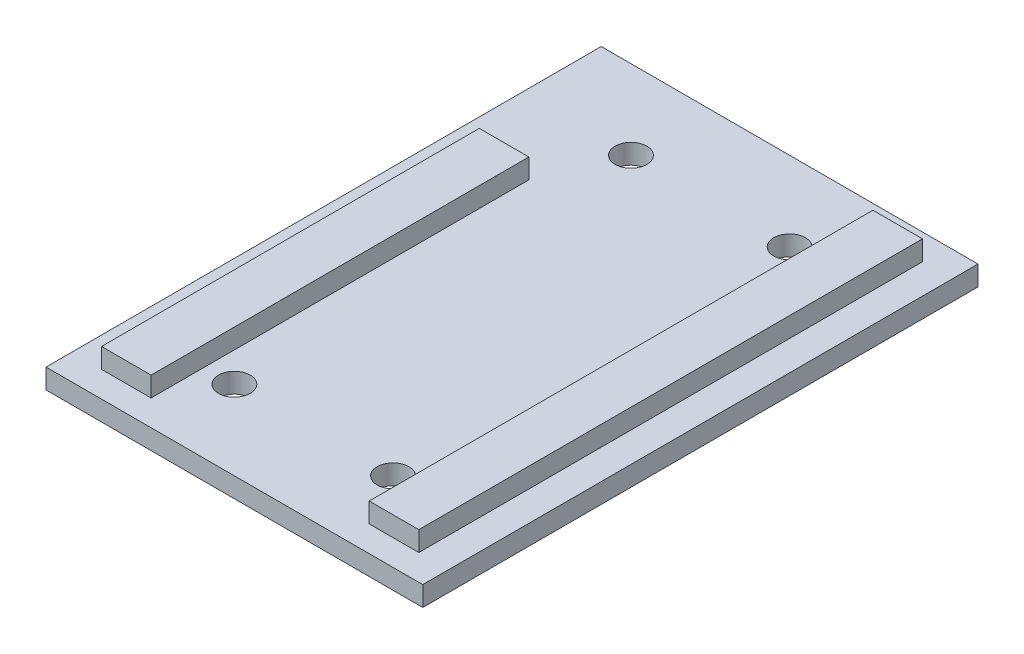
ISO-10303-21;
HEADER;
FILE_DESCRIPTION(('STEP AP214'),'2;1');
FILE_NAME('part.step','',(''),(''),'','','');
FILE_SCHEMA(('AUTOMOTIVE_DESIGN { 1 0 10303 214 1 1 1 1 }'));
ENDSEC;
DATA;
#1=APPLICATION_CONTEXT('core data for automotive mechanical design processes');
#2=APPLICATION_PROTOCOL_DEFINITION('international standard','automotive_design',2000,#1);
#3=PRODUCT_CONTEXT('',#1,'mechanical');
#4=PRODUCT('Part','Part','',(#3));
#5=PRODUCT_RELATED_PRODUCT_CATEGORY('part','',(#4));
#6=PRODUCT_DEFINITION_FORMATION('','',#4);
#7=PRODUCT_DEFINITION_CONTEXT('part definition',#1,'design');
#8=PRODUCT_DEFINITION('design','',#6,#7);
#9=PRODUCT_DEFINITION_SHAPE('','',#8);
#10=(LENGTH_UNIT() NAMED_UNIT(*) SI_UNIT(.MILLI.,.METRE.));
#11=(NAMED_UNIT(*) PLANE_ANGLE_UNIT() SI_UNIT($,.RADIAN.));
#12=(NAMED_UNIT(*) SI_UNIT($,.STERADIAN.) SOLID_ANGLE_UNIT());
#13=UNCERTAINTY_MEASURE_WITH_UNIT(LENGTH_MEASURE(1.E-05),#10,'distance_accuracy_value','');
#14=(GEOMETRIC_REPRESENTATION_CONTEXT(3) GLOBAL_UNCERTAINTY_ASSIGNED_CONTEXT((#13)) GLOBAL_UNIT_ASSIGNED_CONTEXT((#10,
#11,#12)) REPRESENTATION_CONTEXT('',''));
#15=CARTESIAN_POINT('',(0.,0.,0.));
#16=DIRECTION('',(0.,0.,1.));
#17=DIRECTION('',(1.,0.,0.));
#18=AXIS2_PLACEMENT_3D('',#15,#16,#17);
#19=CARTESIAN_POINT('',(0.,2.,0.));
#20=DIRECTION('',(0.,1.,0.));
#21=DIRECTION('',(0.,0.,1.));
#22=AXIS2_PLACEMENT_3D('',#19,#20,#21);
#23=PLANE('',#22);
#24=CARTESIAN_POINT('',(-8.,2.,20.));
#25=DIRECTION('',(0.,1.,0.));
#26=DIRECTION('',(0.,0.,1.));
#27=AXIS2_PLACEMENT_3D('',#24,#25,#26);
#28=CIRCLE('',#27,1.6);
#29=CARTESIAN_POINT('',(-8.,2.,21.6));
#30=VERTEX_POINT('',#29);
#31=EDGE_CURVE('E467',#30,#30,#28,.T.);
#32=ORIENTED_EDGE('',*,*,#31,.F.);
#33=EDGE_LOOP('',(#32));
#34=FACE_BOUND('',#33,.T.);
#35=CARTESIAN_POINT('',(8.,2.,20.));
#36=DIRECTION('',(0.,1.,0.));
#37=DIRECTION('',(0.,0.,1.));
#38=AXIS2_PLACEMENT_3D('',#35,#36,#37);
#39=CIRCLE('',#38,1.6);
#40=CARTESIAN_POINT('',(8.,2.,21.6));
#41=VERTEX_POINT('',#40);
#42=EDGE_CURVE('E471',#41,#41,#39,.T.);
#43=ORIENTED_EDGE('',*,*,#42,.F.);
#44=EDGE_LOOP('',(#43));
#45=FACE_BOUND('',#44,.T.);
#46=CARTESIAN_POINT('',(-8.,2.,-20.));
#47=DIRECTION('',(0.,1.,0.));
#48=DIRECTION('',(0.,0.,1.));
#49=AXIS2_PLACEMENT_3D('',#46,#47,#48);
#50=CIRCLE('',#49,1.6);
#51=CARTESIAN_POINT('',(-8.,2.,-18.4));
#52=VERTEX_POINT('',#51);
#53=EDGE_CURVE('E481',#52,#52,#50,.T.);
#54=ORIENTED_EDGE('',*,*,#53,.F.);
#55=EDGE_LOOP('',(#54));
#56=FACE_BOUND('',#55,.T.);
#57=CARTESIAN_POINT('',(8.,2.,-20.));
#58=DIRECTION('',(0.,1.,0.));
#59=DIRECTION('',(0.,0.,1.));
#60=AXIS2_PLACEMENT_3D('',#57,#58,#59);
#61=CIRCLE('',#60,1.6);
#62=CARTESIAN_POINT('',(8.,2.,-18.4));
#63=VERTEX_POINT('',#62);
#64=EDGE_CURVE('E489',#63,#63,#61,.T.);
#65=ORIENTED_EDGE('',*,*,#64,.F.);
#66=EDGE_LOOP('',(#65));
#67=FACE_BOUND('',#66,.T.);
#68=DIRECTION('',(0.,0.,-1.));
#69=VECTOR('',#68,1.);
#70=CARTESIAN_POINT('',(19.,2.,-28.));
#71=LINE('',#70,#69);
#72=CARTESIAN_POINT('',(19.,2.,28.));
#73=VERTEX_POINT('',#72);
#74=CARTESIAN_POINT('',(19.,2.,-28.));
#75=VERTEX_POINT('',#74);
#76=EDGE_CURVE('E205',#73,#75,#71,.T.);
#77=ORIENTED_EDGE('',*,*,#76,.T.);
#78=DIRECTION('',(-1.,0.,0.));
#79=VECTOR('',#78,1.);
#80=CARTESIAN_POINT('',(-19.,2.,-28.));
#81=LINE('',#80,#79);
#82=CARTESIAN_POINT('',(-19.,2.,-28.));
#83=VERTEX_POINT('',#82);
#84=EDGE_CURVE('E209',#75,#83,#81,.T.);
#85=ORIENTED_EDGE('',*,*,#84,.T.);
#86=DIRECTION('',(0.,0.,1.));
#87=VECTOR('',#86,1.);
#88=CARTESIAN_POINT('',(-19.,2.,-28.));
#89=LINE('',#88,#87);
#90=CARTESIAN_POINT('',(-19.,2.,28.));
#91=VERTEX_POINT('',#90);
#92=EDGE_CURVE('E213',#83,#91,#89,.T.);
#93=ORIENTED_EDGE('',*,*,#92,.T.);
#94=DIRECTION('',(1.,0.,0.));
#95=VECTOR('',#94,1.);
#96=CARTESIAN_POINT('',(-19.,2.,28.));
#97=LINE('',#96,#95);
#98=EDGE_CURVE('E216',#91,#73,#97,.T.);
#99=ORIENTED_EDGE('',*,*,#98,.T.);
#100=EDGE_LOOP('',(#77,#85,#93,#99));
#101=FACE_BOUND('',#100,.T.);
#102=DIRECTION('',(1.,0.,0.));
#103=VECTOR('',#102,1.);
#104=CARTESIAN_POINT('',(-16.,2.,25.4));
#105=LINE('',#104,#103);
#106=CARTESIAN_POINT('',(-16.,2.,25.4));
#107=VERTEX_POINT('',#106);
#108=CARTESIAN_POINT('',(-11.,2.,25.4));
#109=VERTEX_POINT('',#108);
#110=EDGE_CURVE('E165',#107,#109,#105,.T.);
#111=ORIENTED_EDGE('',*,*,#110,.F.);
#112=DIRECTION('',(0.,0.,1.));
#113=VECTOR('',#112,1.);
#114=CARTESIAN_POINT('',(-16.,2.,-12.7));
#115=LINE('',#114,#113);
#116=CARTESIAN_POINT('',(-16.,2.,-12.7));
#117=VERTEX_POINT('',#116);
#118=EDGE_CURVE('E160',#117,#107,#115,.T.);
#119=ORIENTED_EDGE('',*,*,#118,.F.);
#120=DIRECTION('',(-1.,0.,0.));
#121=VECTOR('',#120,1.);
#122=CARTESIAN_POINT('',(-16.,2.,-12.7));
#123=LINE('',#122,#121);
#124=CARTESIAN_POINT('',(-11.,2.,-12.7));
#125=VERTEX_POINT('',#124);
#126=EDGE_CURVE('E175',#125,#117,#123,.T.);
#127=ORIENTED_EDGE('',*,*,#126,.F.);
#128=DIRECTION('',(0.,0.,-1.));
#129=VECTOR('',#128,1.);
#130=CARTESIAN_POINT('',(-11.,2.,-12.7));
#131=LINE('',#130,#129);
#132=EDGE_CURVE('E187',#109,#125,#131,.T.);
#133=ORIENTED_EDGE('',*,*,#132,.F.);
#134=EDGE_LOOP('',(#111,#119,#127,#133));
#135=FACE_BOUND('',#134,.T.);
#136=DIRECTION('',(-1.,0.,0.));
#137=VECTOR('',#136,1.);
#138=CARTESIAN_POINT('',(16.,2.,-25.4));
#139=LINE('',#138,#137);
#140=CARTESIAN_POINT('',(16.,2.,-25.4));
#141=VERTEX_POINT('',#140);
#142=CARTESIAN_POINT('',(11.,2.,-25.4));
#143=VERTEX_POINT('',#142);
#144=EDGE_CURVE('E504',#141,#143,#139,.T.);
#145=ORIENTED_EDGE('',*,*,#144,.F.);
#146=DIRECTION('',(0.,0.,-1.));
#147=VECTOR('',#146,1.);
#148=CARTESIAN_POINT('',(16.,2.,25.4));
#149=LINE('',#148,#147);
#150=CARTESIAN_POINT('',(16.,2.,25.4));
#151=VERTEX_POINT('',#150);
#152=EDGE_CURVE('E157',#151,#141,#149,.T.);
#153=ORIENTED_EDGE('',*,*,#152,.F.);
#154=DIRECTION('',(1.,0.,0.));
#155=VECTOR('',#154,1.);
#156=CARTESIAN_POINT('',(16.,2.,25.4));
#157=LINE('',#156,#155);
#158=CARTESIAN_POINT('',(11.,2.,25.4));
#159=VERTEX_POINT('',#158);
#160=EDGE_CURVE('E153',#159,#151,#157,.T.);
#161=ORIENTED_EDGE('',*,*,#160,.F.);
#162=DIRECTION('',(0.,0.,1.));
#163=VECTOR('',#162,1.);
#164=CARTESIAN_POINT('',(11.,2.,25.4));
#165=LINE('',#164,#163);
#166=EDGE_CURVE('E507',#143,#159,#165,.T.);
#167=ORIENTED_EDGE('',*,*,#166,.F.);
#168=EDGE_LOOP('',(#145,#153,#161,#167));
#169=FACE_BOUND('',#168,.T.);
#170=ADVANCED_FACE('F41',(#34,#45,#56,#67,#101,#135,#169),#23,.T.);
#171=CARTESIAN_POINT('',(19.,2.,-28.));
#172=DIRECTION('',(-1.,0.,0.));
#173=DIRECTION('',(0.,0.,1.));
#174=AXIS2_PLACEMENT_3D('',#171,#172,#173);
#175=PLANE('',#174);
#176=DIRECTION('',(0.,0.,-1.));
#177=VECTOR('',#176,1.);
#178=CARTESIAN_POINT('',(19.,0.,-28.));
#179=LINE('',#178,#177);
#180=CARTESIAN_POINT('',(19.,0.,28.));
#181=VERTEX_POINT('',#180);
#182=CARTESIAN_POINT('',(19.,0.,-28.));
#183=VERTEX_POINT('',#182);
#184=EDGE_CURVE('E204',#181,#183,#179,.T.);
#185=ORIENTED_EDGE('',*,*,#184,.T.);
#186=DIRECTION('',(0.,-1.,0.));
#187=VECTOR('',#186,1.);
#188=CARTESIAN_POINT('',(19.,2.,-28.));
#189=LINE('',#188,#187);
#190=EDGE_CURVE('E11',#75,#183,#189,.T.);
#191=ORIENTED_EDGE('',*,*,#190,.F.);
#192=ORIENTED_EDGE('',*,*,#76,.F.);
#193=DIRECTION('',(0.,-1.,0.));
#194=VECTOR('',#193,1.);
#195=CARTESIAN_POINT('',(19.,2.,28.));
#196=LINE('',#195,#194);
#197=EDGE_CURVE('E219',#73,#181,#196,.T.);
#198=ORIENTED_EDGE('',*,*,#197,.T.);
#199=EDGE_LOOP('',(#185,#191,#192,#198));
#200=FACE_BOUND('',#199,.T.);
#201=ADVANCED_FACE('F43',(#200),#175,.F.);
#202=CARTESIAN_POINT('',(-19.,2.,-28.));
#203=DIRECTION('',(0.,0.,1.));
#204=DIRECTION('',(1.,0.,0.));
#205=AXIS2_PLACEMENT_3D('',#202,#203,#204);
#206=PLANE('',#205);
#207=DIRECTION('',(-1.,0.,0.));
#208=VECTOR('',#207,1.);
#209=CARTESIAN_POINT('',(-19.,0.,-28.));
#210=LINE('',#209,#208);
#211=CARTESIAN_POINT('',(-19.,0.,-28.));
#212=VERTEX_POINT('',#211);
#213=EDGE_CURVE('E223',#183,#212,#210,.T.);
#214=ORIENTED_EDGE('',*,*,#213,.T.);
#215=DIRECTION('',(0.,-1.,0.));
#216=VECTOR('',#215,1.);
#217=CARTESIAN_POINT('',(-19.,2.,-28.));
#218=LINE('',#217,#216);
#219=EDGE_CURVE('E50',#83,#212,#218,.T.);
#220=ORIENTED_EDGE('',*,*,#219,.F.);
#221=ORIENTED_EDGE('',*,*,#84,.F.);
#222=ORIENTED_EDGE('',*,*,#190,.T.);
#223=EDGE_LOOP('',(#214,#220,#221,#222));
#224=FACE_BOUND('',#223,.T.);
#225=ADVANCED_FACE('F259',(#224),#206,.F.);
#226=CARTESIAN_POINT('',(-19.,2.,-28.));
#227=DIRECTION('',(1.,0.,0.));
#228=DIRECTION('',(0.,0.,-1.));
#229=AXIS2_PLACEMENT_3D('',#226,#227,#228);
#230=PLANE('',#229);
#231=DIRECTION('',(0.,0.,1.));
#232=VECTOR('',#231,1.);
#233=CARTESIAN_POINT('',(-19.,0.,-28.));
#234=LINE('',#233,#232);
#235=CARTESIAN_POINT('',(-19.,0.,28.));
#236=VERTEX_POINT('',#235);
#237=EDGE_CURVE('E226',#212,#236,#234,.T.);
#238=ORIENTED_EDGE('',*,*,#237,.T.);
#239=DIRECTION('',(0.,-1.,0.));
#240=VECTOR('',#239,1.);
#241=CARTESIAN_POINT('',(-19.,2.,28.));
#242=LINE('',#241,#240);
#243=EDGE_CURVE('E234',#91,#236,#242,.T.);
#244=ORIENTED_EDGE('',*,*,#243,.F.);
#245=ORIENTED_EDGE('',*,*,#92,.F.);
#246=ORIENTED_EDGE('',*,*,#219,.T.);
#247=EDGE_LOOP('',(#238,#244,#245,#246));
#248=FACE_BOUND('',#247,.T.);
#249=ADVANCED_FACE('F243',(#248),#230,.F.);
#250=CARTESIAN_POINT('',(-19.,2.,28.));
#251=DIRECTION('',(0.,0.,-1.));
#252=DIRECTION('',(-1.,0.,0.));
#253=AXIS2_PLACEMENT_3D('',#250,#251,#252);
#254=PLANE('',#253);
#255=DIRECTION('',(1.,0.,0.));
#256=VECTOR('',#255,1.);
#257=CARTESIAN_POINT('',(-19.,0.,28.));
#258=LINE('',#257,#256);
#259=EDGE_CURVE('E210',#236,#181,#258,.T.);
#260=ORIENTED_EDGE('',*,*,#259,.T.);
#261=ORIENTED_EDGE('',*,*,#197,.F.);
#262=ORIENTED_EDGE('',*,*,#98,.F.);
#263=ORIENTED_EDGE('',*,*,#243,.T.);
#264=EDGE_LOOP('',(#260,#261,#262,#263));
#265=FACE_BOUND('',#264,.T.);
#266=ADVANCED_FACE('F252',(#265),#254,.F.);
#267=CARTESIAN_POINT('',(0.,0.,0.));
#268=DIRECTION('',(0.,1.,0.));
#269=DIRECTION('',(0.,0.,1.));
#270=AXIS2_PLACEMENT_3D('',#267,#268,#269);
#271=PLANE('',#270);
#272=CARTESIAN_POINT('',(-8.,0.,20.));
#273=DIRECTION('',(0.,1.,0.));
#274=DIRECTION('',(0.,0.,1.));
#275=AXIS2_PLACEMENT_3D('',#272,#273,#274);
#276=CIRCLE('',#275,1.6);
#277=CARTESIAN_POINT('',(-8.,0.,21.6));
#278=VERTEX_POINT('',#277);
#279=EDGE_CURVE('E465',#278,#278,#276,.T.);
#280=ORIENTED_EDGE('',*,*,#279,.T.);
#281=EDGE_LOOP('',(#280));
#282=FACE_BOUND('',#281,.T.);
#283=CARTESIAN_POINT('',(8.,0.,20.));
#284=DIRECTION('',(0.,1.,0.));
#285=DIRECTION('',(0.,0.,1.));
#286=AXIS2_PLACEMENT_3D('',#283,#284,#285);
#287=CIRCLE('',#286,1.6);
#288=CARTESIAN_POINT('',(8.,0.,21.6));
#289=VERTEX_POINT('',#288);
#290=EDGE_CURVE('E477',#289,#289,#287,.T.);
#291=ORIENTED_EDGE('',*,*,#290,.T.);
#292=EDGE_LOOP('',(#291));
#293=FACE_BOUND('',#292,.T.);
#294=CARTESIAN_POINT('',(-8.,0.,-20.));
#295=DIRECTION('',(0.,1.,0.));
#296=DIRECTION('',(0.,0.,1.));
#297=AXIS2_PLACEMENT_3D('',#294,#295,#296);
#298=CIRCLE('',#297,1.6);
#299=CARTESIAN_POINT('',(-8.,0.,-18.4));
#300=VERTEX_POINT('',#299);
#301=EDGE_CURVE('E485',#300,#300,#298,.T.);
#302=ORIENTED_EDGE('',*,*,#301,.T.);
#303=EDGE_LOOP('',(#302));
#304=FACE_BOUND('',#303,.T.);
#305=CARTESIAN_POINT('',(8.,0.,-20.));
#306=DIRECTION('',(0.,1.,0.));
#307=DIRECTION('',(0.,0.,1.));
#308=AXIS2_PLACEMENT_3D('',#305,#306,#307);
#309=CIRCLE('',#308,1.6);
#310=CARTESIAN_POINT('',(8.,0.,-18.4));
#311=VERTEX_POINT('',#310);
#312=EDGE_CURVE('E493',#311,#311,#309,.T.);
#313=ORIENTED_EDGE('',*,*,#312,.T.);
#314=EDGE_LOOP('',(#313));
#315=FACE_BOUND('',#314,.T.);
#316=ORIENTED_EDGE('',*,*,#184,.F.);
#317=ORIENTED_EDGE('',*,*,#259,.F.);
#318=ORIENTED_EDGE('',*,*,#237,.F.);
#319=ORIENTED_EDGE('',*,*,#213,.F.);
#320=EDGE_LOOP('',(#316,#317,#318,#319));
#321=FACE_BOUND('',#320,.T.);
#322=ADVANCED_FACE('F249',(#282,#293,#304,#315,#321),#271,.F.);
#323=CARTESIAN_POINT('',(-16.,4.,-12.7));
#324=DIRECTION('',(1.,0.,0.));
#325=DIRECTION('',(0.,0.,-1.));
#326=AXIS2_PLACEMENT_3D('',#323,#324,#325);
#327=PLANE('',#326);
#328=ORIENTED_EDGE('',*,*,#118,.T.);
#329=DIRECTION('',(0.,-1.,0.));
#330=VECTOR('',#329,1.);
#331=CARTESIAN_POINT('',(-16.,4.,25.4));
#332=LINE('',#331,#330);
#333=CARTESIAN_POINT('',(-16.,4.,25.4));
#334=VERTEX_POINT('',#333);
#335=EDGE_CURVE('E201',#334,#107,#332,.T.);
#336=ORIENTED_EDGE('',*,*,#335,.F.);
#337=DIRECTION('',(0.,0.,1.));
#338=VECTOR('',#337,1.);
#339=CARTESIAN_POINT('',(-16.,4.,-12.7));
#340=LINE('',#339,#338);
#341=CARTESIAN_POINT('',(-16.,4.,-12.7));
#342=VERTEX_POINT('',#341);
#343=EDGE_CURVE('E170',#342,#334,#340,.T.);
#344=ORIENTED_EDGE('',*,*,#343,.F.);
#345=DIRECTION('',(0.,-1.,0.));
#346=VECTOR('',#345,1.);
#347=CARTESIAN_POINT('',(-16.,4.,-12.7));
#348=LINE('',#347,#346);
#349=EDGE_CURVE('E183',#342,#117,#348,.T.);
#350=ORIENTED_EDGE('',*,*,#349,.T.);
#351=EDGE_LOOP('',(#328,#336,#344,#350));
#352=FACE_BOUND('',#351,.T.);
#353=ADVANCED_FACE('F275',(#352),#327,.F.);
#354=CARTESIAN_POINT('',(-16.,4.,25.4));
#355=DIRECTION('',(0.,0.,-1.));
#356=DIRECTION('',(-1.,0.,0.));
#357=AXIS2_PLACEMENT_3D('',#354,#355,#356);
#358=PLANE('',#357);
#359=ORIENTED_EDGE('',*,*,#110,.T.);
#360=DIRECTION('',(0.,-1.,0.));
#361=VECTOR('',#360,1.);
#362=CARTESIAN_POINT('',(-11.,4.,25.4));
#363=LINE('',#362,#361);
#364=CARTESIAN_POINT('',(-11.,4.,25.4));
#365=VERTEX_POINT('',#364);
#366=EDGE_CURVE('E197',#365,#109,#363,.T.);
#367=ORIENTED_EDGE('',*,*,#366,.F.);
#368=DIRECTION('',(1.,0.,0.));
#369=VECTOR('',#368,1.);
#370=CARTESIAN_POINT('',(-16.,4.,25.4));
#371=LINE('',#370,#369);
#372=EDGE_CURVE('E174',#334,#365,#371,.T.);
#373=ORIENTED_EDGE('',*,*,#372,.F.);
#374=ORIENTED_EDGE('',*,*,#335,.T.);
#375=EDGE_LOOP('',(#359,#367,#373,#374));
#376=FACE_BOUND('',#375,.T.);
#377=ADVANCED_FACE('F298',(#376),#358,.F.);
#378=CARTESIAN_POINT('',(-11.,4.,-12.7));
#379=DIRECTION('',(-1.,0.,0.));
#380=DIRECTION('',(0.,0.,1.));
#381=AXIS2_PLACEMENT_3D('',#378,#379,#380);
#382=PLANE('',#381);
#383=ORIENTED_EDGE('',*,*,#132,.T.);
#384=DIRECTION('',(0.,-1.,0.));
#385=VECTOR('',#384,1.);
#386=CARTESIAN_POINT('',(-11.,4.,-12.7));
#387=LINE('',#386,#385);
#388=CARTESIAN_POINT('',(-11.,4.,-12.7));
#389=VERTEX_POINT('',#388);
#390=EDGE_CURVE('E65',#389,#125,#387,.T.);
#391=ORIENTED_EDGE('',*,*,#390,.F.);
#392=DIRECTION('',(0.,0.,-1.));
#393=VECTOR('',#392,1.);
#394=CARTESIAN_POINT('',(-11.,4.,-12.7));
#395=LINE('',#394,#393);
#396=EDGE_CURVE('E178',#365,#389,#395,.T.);
#397=ORIENTED_EDGE('',*,*,#396,.F.);
#398=ORIENTED_EDGE('',*,*,#366,.T.);
#399=EDGE_LOOP('',(#383,#391,#397,#398));
#400=FACE_BOUND('',#399,.T.);
#401=ADVANCED_FACE('F305',(#400),#382,.F.);
#402=CARTESIAN_POINT('',(-16.,4.,-12.7));
#403=DIRECTION('',(0.,0.,1.));
#404=DIRECTION('',(1.,0.,0.));
#405=AXIS2_PLACEMENT_3D('',#402,#403,#404);
#406=PLANE('',#405);
#407=ORIENTED_EDGE('',*,*,#126,.T.);
#408=ORIENTED_EDGE('',*,*,#349,.F.);
#409=DIRECTION('',(-1.,0.,0.));
#410=VECTOR('',#409,1.);
#411=CARTESIAN_POINT('',(-16.,4.,-12.7));
#412=LINE('',#411,#410);
#413=EDGE_CURVE('E181',#389,#342,#412,.T.);
#414=ORIENTED_EDGE('',*,*,#413,.F.);
#415=ORIENTED_EDGE('',*,*,#390,.T.);
#416=EDGE_LOOP('',(#407,#408,#414,#415));
#417=FACE_BOUND('',#416,.T.);
#418=ADVANCED_FACE('F312',(#417),#406,.F.);
#419=CARTESIAN_POINT('',(0.,4.,0.));
#420=DIRECTION('',(0.,1.,0.));
#421=DIRECTION('',(0.,0.,1.));
#422=AXIS2_PLACEMENT_3D('',#419,#420,#421);
#423=PLANE('',#422);
#424=ORIENTED_EDGE('',*,*,#343,.T.);
#425=ORIENTED_EDGE('',*,*,#372,.T.);
#426=ORIENTED_EDGE('',*,*,#396,.T.);
#427=ORIENTED_EDGE('',*,*,#413,.T.);
#428=EDGE_LOOP('',(#424,#425,#426,#427));
#429=FACE_BOUND('',#428,.T.);
#430=ADVANCED_FACE('F320',(#429),#423,.T.);
#431=CARTESIAN_POINT('',(16.,4.,25.4));
#432=DIRECTION('',(-1.,0.,0.));
#433=DIRECTION('',(0.,0.,1.));
#434=AXIS2_PLACEMENT_3D('',#431,#432,#433);
#435=PLANE('',#434);
#436=ORIENTED_EDGE('',*,*,#152,.T.);
#437=DIRECTION('',(0.,-1.,0.));
#438=VECTOR('',#437,1.);
#439=CARTESIAN_POINT('',(16.,4.,-25.4));
#440=LINE('',#439,#438);
#441=CARTESIAN_POINT('',(16.,4.,-25.4));
#442=VERTEX_POINT('',#441);
#443=EDGE_CURVE('E136',#442,#141,#440,.T.);
#444=ORIENTED_EDGE('',*,*,#443,.F.);
#445=DIRECTION('',(0.,0.,-1.));
#446=VECTOR('',#445,1.);
#447=CARTESIAN_POINT('',(16.,4.,25.4));
#448=LINE('',#447,#446);
#449=CARTESIAN_POINT('',(16.,4.,25.4));
#450=VERTEX_POINT('',#449);
#451=EDGE_CURVE('E144',#450,#442,#448,.T.);
#452=ORIENTED_EDGE('',*,*,#451,.F.);
#453=DIRECTION('',(0.,-1.,0.));
#454=VECTOR('',#453,1.);
#455=CARTESIAN_POINT('',(16.,4.,25.4));
#456=LINE('',#455,#454);
#457=EDGE_CURVE('E501',#450,#151,#456,.T.);
#458=ORIENTED_EDGE('',*,*,#457,.T.);
#459=EDGE_LOOP('',(#436,#444,#452,#458));
#460=FACE_BOUND('',#459,.T.);
#461=ADVANCED_FACE('F155',(#460),#435,.F.);
#462=CARTESIAN_POINT('',(16.,4.,-25.4));
#463=DIRECTION('',(0.,0.,1.));
#464=DIRECTION('',(1.,0.,0.));
#465=AXIS2_PLACEMENT_3D('',#462,#463,#464);
#466=PLANE('',#465);
#467=ORIENTED_EDGE('',*,*,#144,.T.);
#468=DIRECTION('',(0.,-1.,0.));
#469=VECTOR('',#468,1.);
#470=CARTESIAN_POINT('',(11.,4.,-25.4));
#471=LINE('',#470,#469);
#472=CARTESIAN_POINT('',(11.,4.,-25.4));
#473=VERTEX_POINT('',#472);
#474=EDGE_CURVE('E139',#473,#143,#471,.T.);
#475=ORIENTED_EDGE('',*,*,#474,.F.);
#476=DIRECTION('',(-1.,0.,0.));
#477=VECTOR('',#476,1.);
#478=CARTESIAN_POINT('',(16.,4.,-25.4));
#479=LINE('',#478,#477);
#480=EDGE_CURVE('E132',#442,#473,#479,.T.);
#481=ORIENTED_EDGE('',*,*,#480,.F.);
#482=ORIENTED_EDGE('',*,*,#443,.T.);
#483=EDGE_LOOP('',(#467,#475,#481,#482));
#484=FACE_BOUND('',#483,.T.);
#485=ADVANCED_FACE('F134',(#484),#466,.F.);
#486=CARTESIAN_POINT('',(11.,4.,25.4));
#487=DIRECTION('',(1.,0.,0.));
#488=DIRECTION('',(0.,0.,-1.));
#489=AXIS2_PLACEMENT_3D('',#486,#487,#488);
#490=PLANE('',#489);
#491=ORIENTED_EDGE('',*,*,#166,.T.);
#492=DIRECTION('',(0.,-1.,0.));
#493=VECTOR('',#492,1.);
#494=CARTESIAN_POINT('',(11.,4.,25.4));
#495=LINE('',#494,#493);
#496=CARTESIAN_POINT('',(11.,4.,25.4));
#497=VERTEX_POINT('',#496);
#498=EDGE_CURVE('E57',#497,#159,#495,.T.);
#499=ORIENTED_EDGE('',*,*,#498,.F.);
#500=DIRECTION('',(0.,0.,1.));
#501=VECTOR('',#500,1.);
#502=CARTESIAN_POINT('',(11.,4.,25.4));
#503=LINE('',#502,#501);
#504=EDGE_CURVE('E143',#473,#497,#503,.T.);
#505=ORIENTED_EDGE('',*,*,#504,.F.);
#506=ORIENTED_EDGE('',*,*,#474,.T.);
#507=EDGE_LOOP('',(#491,#499,#505,#506));
#508=FACE_BOUND('',#507,.T.);
#509=ADVANCED_FACE('F340',(#508),#490,.F.);
#510=CARTESIAN_POINT('',(16.,4.,25.4));
#511=DIRECTION('',(0.,0.,-1.));
#512=DIRECTION('',(-1.,0.,0.));
#513=AXIS2_PLACEMENT_3D('',#510,#511,#512);
#514=PLANE('',#513);
#515=ORIENTED_EDGE('',*,*,#160,.T.);
#516=ORIENTED_EDGE('',*,*,#457,.F.);
#517=DIRECTION('',(1.,0.,0.));
#518=VECTOR('',#517,1.);
#519=CARTESIAN_POINT('',(16.,4.,25.4));
#520=LINE('',#519,#518);
#521=EDGE_CURVE('E148',#497,#450,#520,.T.);
#522=ORIENTED_EDGE('',*,*,#521,.F.);
#523=ORIENTED_EDGE('',*,*,#498,.T.);
#524=EDGE_LOOP('',(#515,#516,#522,#523));
#525=FACE_BOUND('',#524,.T.);
#526=ADVANCED_FACE('F347',(#525),#514,.F.);
#527=CARTESIAN_POINT('',(0.,4.,0.));
#528=DIRECTION('',(0.,1.,0.));
#529=DIRECTION('',(0.,0.,1.));
#530=AXIS2_PLACEMENT_3D('',#527,#528,#529);
#531=PLANE('',#530);
#532=ORIENTED_EDGE('',*,*,#451,.T.);
#533=ORIENTED_EDGE('',*,*,#480,.T.);
#534=ORIENTED_EDGE('',*,*,#504,.T.);
#535=ORIENTED_EDGE('',*,*,#521,.T.);
#536=EDGE_LOOP('',(#532,#533,#534,#535));
#537=FACE_BOUND('',#536,.T.);
#538=ADVANCED_FACE('F147',(#537),#531,.T.);
#539=CARTESIAN_POINT('',(8.,2.,-20.));
#540=DIRECTION('',(0.,1.,0.));
#541=DIRECTION('',(0.,0.,1.));
#542=AXIS2_PLACEMENT_3D('',#539,#540,#541);
#543=CYLINDRICAL_SURFACE('',#542,1.6);
#544=ORIENTED_EDGE('',*,*,#312,.F.);
#545=EDGE_LOOP('',(#544));
#546=FACE_BOUND('',#545,.T.);
#547=ORIENTED_EDGE('',*,*,#64,.T.);
#548=EDGE_LOOP('',(#547));
#549=FACE_BOUND('',#548,.T.);
#550=ADVANCED_FACE('F361',(#546,#549),#543,.F.);
#551=CARTESIAN_POINT('',(-8.,2.,-20.));
#552=DIRECTION('',(0.,1.,0.));
#553=DIRECTION('',(0.,0.,1.));
#554=AXIS2_PLACEMENT_3D('',#551,#552,#553);
#555=CYLINDRICAL_SURFACE('',#554,1.6);
#556=ORIENTED_EDGE('',*,*,#301,.F.);
#557=EDGE_LOOP('',(#556));
#558=FACE_BOUND('',#557,.T.);
#559=ORIENTED_EDGE('',*,*,#53,.T.);
#560=EDGE_LOOP('',(#559));
#561=FACE_BOUND('',#560,.T.);
#562=ADVANCED_FACE('F369',(#558,#561),#555,.F.);
#563=CARTESIAN_POINT('',(8.,2.,20.));
#564=DIRECTION('',(0.,1.,0.));
#565=DIRECTION('',(0.,0.,1.));
#566=AXIS2_PLACEMENT_3D('',#563,#564,#565);
#567=CYLINDRICAL_SURFACE('',#566,1.6);
#568=ORIENTED_EDGE('',*,*,#290,.F.);
#569=EDGE_LOOP('',(#568));
#570=FACE_BOUND('',#569,.T.);
#571=ORIENTED_EDGE('',*,*,#42,.T.);
#572=EDGE_LOOP('',(#571));
#573=FACE_BOUND('',#572,.T.);
#574=ADVANCED_FACE('F377',(#570,#573),#567,.F.);
#575=CARTESIAN_POINT('',(-8.,2.,20.));
#576=DIRECTION('',(0.,1.,0.));
#577=DIRECTION('',(0.,0.,1.));
#578=AXIS2_PLACEMENT_3D('',#575,#576,#577);
#579=CYLINDRICAL_SURFACE('',#578,1.6);
#580=ORIENTED_EDGE('',*,*,#279,.F.);
#581=EDGE_LOOP('',(#580));
#582=FACE_BOUND('',#581,.T.);
#583=ORIENTED_EDGE('',*,*,#31,.T.);
#584=EDGE_LOOP('',(#583));
#585=FACE_BOUND('',#584,.T.);
#586=ADVANCED_FACE('F384',(#582,#585),#579,.F.);
#587=CLOSED_SHELL('',(#170,#201,#225,#249,#266,#322,#353,#377,#401,#418,#430,#461,#485,#509,
#526,#538,#550,#562,#574,#586));
#588=MANIFOLD_SOLID_BREP('B2',#587);
#589=ADVANCED_BREP_SHAPE_REPRESENTATION('',(#18,#588),#14);
#590=SHAPE_DEFINITION_REPRESENTATION(#9,#589);
ENDSEC;
END-ISO-10303-21;
